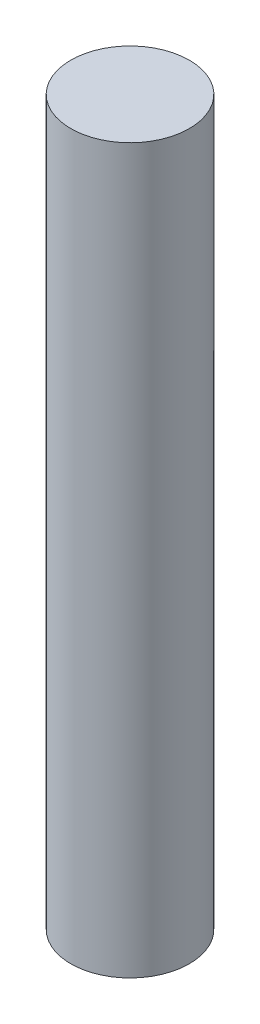
ISO-10303-21;
HEADER;
FILE_DESCRIPTION(('STEP AP214'),'2;1');
FILE_NAME('part.step','',(''),(''),'','','');
FILE_SCHEMA(('AUTOMOTIVE_DESIGN { 1 0 10303 214 1 1 1 1 }'));
ENDSEC;
DATA;
#1=APPLICATION_CONTEXT('core data for automotive mechanical design processes');
#2=APPLICATION_PROTOCOL_DEFINITION('international standard','automotive_design',2000,#1);
#3=PRODUCT_CONTEXT('',#1,'mechanical');
#4=PRODUCT('Part','Part','',(#3));
#5=PRODUCT_RELATED_PRODUCT_CATEGORY('part','',(#4));
#6=PRODUCT_DEFINITION_FORMATION('','',#4);
#7=PRODUCT_DEFINITION_CONTEXT('part definition',#1,'design');
#8=PRODUCT_DEFINITION('design','',#6,#7);
#9=PRODUCT_DEFINITION_SHAPE('','',#8);
#10=(LENGTH_UNIT() NAMED_UNIT(*) SI_UNIT(.MILLI.,.METRE.));
#11=(NAMED_UNIT(*) PLANE_ANGLE_UNIT() SI_UNIT($,.RADIAN.));
#12=(NAMED_UNIT(*) SI_UNIT($,.STERADIAN.) SOLID_ANGLE_UNIT());
#13=UNCERTAINTY_MEASURE_WITH_UNIT(LENGTH_MEASURE(1.E-05),#10,'distance_accuracy_value','');
#14=(GEOMETRIC_REPRESENTATION_CONTEXT(3) GLOBAL_UNCERTAINTY_ASSIGNED_CONTEXT((#13)) GLOBAL_UNIT_ASSIGNED_CONTEXT((#10,
#11,#12)) REPRESENTATION_CONTEXT('',''));
#15=CARTESIAN_POINT('',(0.,0.,0.));
#16=DIRECTION('',(0.,0.,1.));
#17=DIRECTION('',(1.,0.,0.));
#18=AXIS2_PLACEMENT_3D('',#15,#16,#17);
#19=CARTESIAN_POINT('',(0.,61.,0.));
#20=DIRECTION('',(0.,-1.,0.));
#21=DIRECTION('',(0.,0.,-1.));
#22=AXIS2_PLACEMENT_3D('',#19,#20,#21);
#23=CYLINDRICAL_SURFACE('',#22,10.);
#24=CARTESIAN_POINT('',(0.,61.,0.));
#25=DIRECTION('',(0.,1.,0.));
#26=DIRECTION('',(0.,0.,1.));
#27=AXIS2_PLACEMENT_3D('',#24,#25,#26);
#28=CIRCLE('',#27,10.);
#29=CARTESIAN_POINT('',(0.,61.,-10.));
#30=VERTEX_POINT('',#29);
#31=EDGE_CURVE('E10',#30,#30,#28,.T.);
#32=CARTESIAN_POINT('',(0.,-61.,0.));
#33=DIRECTION('',(0.,1.,0.));
#34=DIRECTION('',(0.,0.,1.));
#35=AXIS2_PLACEMENT_3D('',#32,#33,#34);
#36=CIRCLE('',#35,10.);
#37=CARTESIAN_POINT('',(0.,-61.,-10.));
#38=VERTEX_POINT('',#37);
#39=EDGE_CURVE('E39',#38,#38,#36,.T.);
#40=CARTESIAN_POINT('',(0.,61.,-10.));
#41=CARTESIAN_POINT('',(0.,59.7291666666667,-10.));
#42=CARTESIAN_POINT('',(0.,58.4583333333333,-10.));
#43=CARTESIAN_POINT('',(0.,55.9166666666667,-10.));
#44=CARTESIAN_POINT('',(0.,54.6458333333333,-10.));
#45=CARTESIAN_POINT('',(0.,52.1041666666667,-10.));
#46=CARTESIAN_POINT('',(0.,50.8333333333333,-10.));
#47=CARTESIAN_POINT('',(0.,48.2916666666667,-10.));
#48=CARTESIAN_POINT('',(0.,47.0208333333333,-10.));
#49=CARTESIAN_POINT('',(0.,44.4791666666667,-10.));
#50=CARTESIAN_POINT('',(0.,43.2083333333333,-10.));
#51=CARTESIAN_POINT('',(0.,40.6666666666667,-10.));
#52=CARTESIAN_POINT('',(0.,39.3958333333333,-10.));
#53=CARTESIAN_POINT('',(0.,36.8541666666667,-10.));
#54=CARTESIAN_POINT('',(0.,35.5833333333333,-10.));
#55=CARTESIAN_POINT('',(0.,33.0416666666667,-10.));
#56=CARTESIAN_POINT('',(0.,31.7708333333333,-10.));
#57=CARTESIAN_POINT('',(0.,29.2291666666667,-10.));
#58=CARTESIAN_POINT('',(0.,27.9583333333333,-10.));
#59=CARTESIAN_POINT('',(0.,25.4166666666667,-10.));
#60=CARTESIAN_POINT('',(0.,24.1458333333333,-10.));
#61=CARTESIAN_POINT('',(0.,21.6041666666667,-10.));
#62=CARTESIAN_POINT('',(0.,20.3333333333333,-10.));
#63=CARTESIAN_POINT('',(0.,17.7916666666667,-10.));
#64=CARTESIAN_POINT('',(0.,16.5208333333333,-10.));
#65=CARTESIAN_POINT('',(0.,13.9791666666667,-10.));
#66=CARTESIAN_POINT('',(0.,12.7083333333333,-10.));
#67=CARTESIAN_POINT('',(0.,10.1666666666667,-10.));
#68=CARTESIAN_POINT('',(0.,8.89583333333332,-10.));
#69=CARTESIAN_POINT('',(0.,6.35416666666665,-10.));
#70=CARTESIAN_POINT('',(0.,5.08333333333332,-10.));
#71=CARTESIAN_POINT('',(0.,2.54166666666665,-10.));
#72=CARTESIAN_POINT('',(0.,1.27083333333332,-10.));
#73=CARTESIAN_POINT('',(0.,-1.27083333333334,-10.));
#74=CARTESIAN_POINT('',(0.,-2.54166666666667,-10.));
#75=CARTESIAN_POINT('',(0.,-5.08333333333333,-10.));
#76=CARTESIAN_POINT('',(0.,-6.35416666666667,-10.));
#77=CARTESIAN_POINT('',(0.,-8.89583333333334,-10.));
#78=CARTESIAN_POINT('',(0.,-10.1666666666667,-10.));
#79=CARTESIAN_POINT('',(0.,-12.7083333333333,-10.));
#80=CARTESIAN_POINT('',(0.,-13.9791666666667,-10.));
#81=CARTESIAN_POINT('',(0.,-16.5208333333333,-10.));
#82=CARTESIAN_POINT('',(0.,-17.7916666666667,-10.));
#83=CARTESIAN_POINT('',(0.,-20.3333333333333,-10.));
#84=CARTESIAN_POINT('',(0.,-21.6041666666667,-10.));
#85=CARTESIAN_POINT('',(0.,-24.1458333333333,-10.));
#86=CARTESIAN_POINT('',(0.,-25.4166666666667,-10.));
#87=CARTESIAN_POINT('',(0.,-27.9583333333333,-10.));
#88=CARTESIAN_POINT('',(0.,-29.2291666666667,-10.));
#89=CARTESIAN_POINT('',(0.,-31.7708333333333,-10.));
#90=CARTESIAN_POINT('',(0.,-33.0416666666667,-10.));
#91=CARTESIAN_POINT('',(0.,-35.5833333333333,-10.));
#92=CARTESIAN_POINT('',(0.,-36.8541666666667,-10.));
#93=CARTESIAN_POINT('',(0.,-39.3958333333333,-10.));
#94=CARTESIAN_POINT('',(0.,-40.6666666666667,-10.));
#95=CARTESIAN_POINT('',(0.,-43.2083333333333,-10.));
#96=CARTESIAN_POINT('',(0.,-44.4791666666667,-10.));
#97=CARTESIAN_POINT('',(0.,-47.0208333333333,-10.));
#98=CARTESIAN_POINT('',(0.,-48.2916666666667,-10.));
#99=CARTESIAN_POINT('',(0.,-50.8333333333333,-10.));
#100=CARTESIAN_POINT('',(0.,-52.1041666666667,-10.));
#101=CARTESIAN_POINT('',(0.,-54.6458333333333,-10.));
#102=CARTESIAN_POINT('',(0.,-55.9166666666667,-10.));
#103=CARTESIAN_POINT('',(0.,-58.4583333333333,-10.));
#104=CARTESIAN_POINT('',(0.,-59.7291666666667,-10.));
#105=CARTESIAN_POINT('',(0.,-61.,-10.));
#106=B_SPLINE_CURVE_WITH_KNOTS('',3,(#40,#41,#42,#43,#44,#45,#46,#47,#48,#49,#50,#51,#52,#53,
#54,#55,#56,#57,#58,#59,#60,#61,#62,#63,#64,#65,#66,#67,#68,#69,#70,#71,#72,#73,#74,#75,#76,#77,
#78,#79,#80,#81,#82,#83,#84,#85,#86,#87,#88,#89,#90,#91,#92,#93,#94,#95,#96,#97,#98,#99,#100,
#101,#102,#103,#104,#105),.UNSPECIFIED.,.F.,.F.,(4,2,2,2,2,2,2,2,2,2,2,2,2,2,2,2,2,2,2,2,2,2,2,
2,2,2,2,2,2,2,2,2,4),(0.,3.8125,7.625,11.4375,15.25,19.0625,22.875,26.6875,30.5,34.3125,38.125,
41.9375,45.75,49.5625,53.375,57.1875,61.,64.8125,68.625,72.4375,76.25,80.0625,83.875,87.6875,
91.5,95.3125,99.125,102.9375,106.75,110.5625,114.375,118.1875,122.),.UNSPECIFIED.);
#107=EDGE_CURVE('BSEAM36',#30,#38,#106,.T.);
#108=ORIENTED_EDGE('',*,*,#31,.F.);
#109=ORIENTED_EDGE('',*,*,#39,.T.);
#110=ORIENTED_EDGE('',*,*,#107,.T.);
#111=ORIENTED_EDGE('',*,*,#107,.F.);
#112=EDGE_LOOP('',(#108,#110,#109,#111));
#113=FACE_BOUND('',#112,.T.);
#114=ADVANCED_FACE('F36',(#113),#23,.T.);
#115=CARTESIAN_POINT('',(0.,61.,0.));
#116=DIRECTION('',(0.,1.,0.));
#117=DIRECTION('',(0.,0.,1.));
#118=AXIS2_PLACEMENT_3D('',#115,#116,#117);
#119=PLANE('',#118);
#120=ORIENTED_EDGE('',*,*,#31,.T.);
#121=EDGE_LOOP('',(#120));
#122=FACE_BOUND('',#121,.T.);
#123=ADVANCED_FACE('F51',(#122),#119,.T.);
#124=CARTESIAN_POINT('',(0.,-61.,0.));
#125=DIRECTION('',(0.,1.,0.));
#126=DIRECTION('',(0.,0.,1.));
#127=AXIS2_PLACEMENT_3D('',#124,#125,#126);
#128=PLANE('',#127);
#129=ORIENTED_EDGE('',*,*,#39,.F.);
#130=EDGE_LOOP('',(#129));
#131=FACE_BOUND('',#130,.T.);
#132=ADVANCED_FACE('F49',(#131),#128,.F.);
#133=CLOSED_SHELL('',(#114,#123,#132));
#134=MANIFOLD_SOLID_BREP('B2',#133);
#135=ADVANCED_BREP_SHAPE_REPRESENTATION('',(#18,#134),#14);
#136=SHAPE_DEFINITION_REPRESENTATION(#9,#135);
ENDSEC;
END-ISO-10303-21;
